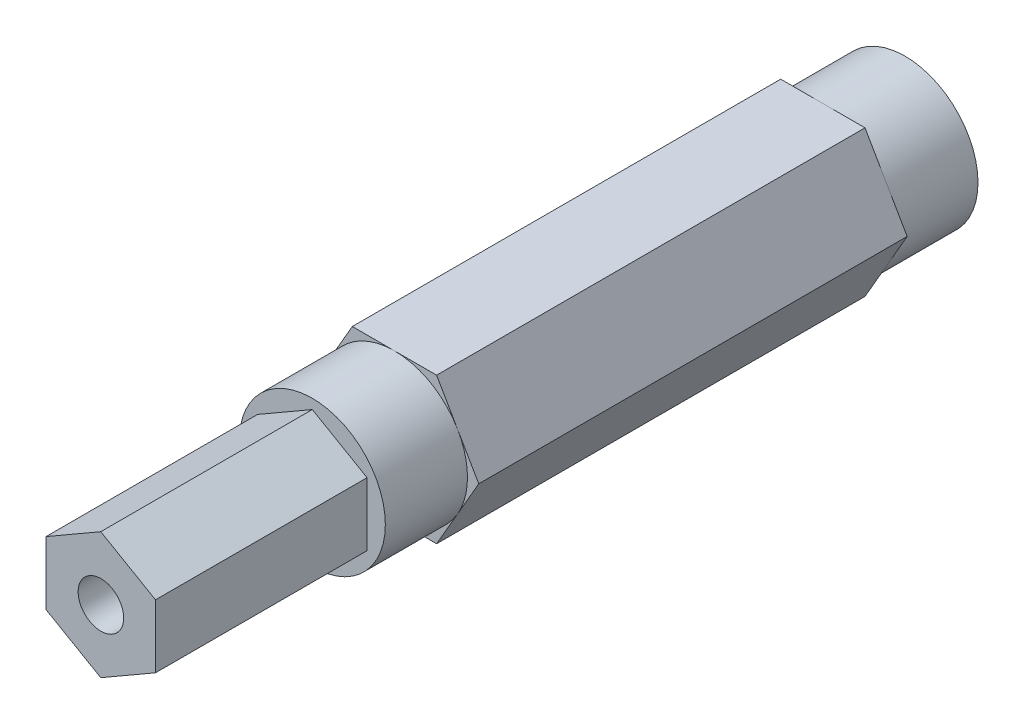
ISO-10303-21;
HEADER;
FILE_DESCRIPTION(('STEP AP214'),'2;1');
FILE_NAME('part.step','',(''),(''),'','','');
FILE_SCHEMA(('AUTOMOTIVE_DESIGN { 1 0 10303 214 1 1 1 1 }'));
ENDSEC;
DATA;
#1=APPLICATION_CONTEXT('core data for automotive mechanical design processes');
#2=APPLICATION_PROTOCOL_DEFINITION('international standard','automotive_design',2000,#1);
#3=PRODUCT_CONTEXT('',#1,'mechanical');
#4=PRODUCT('Part','Part','',(#3));
#5=PRODUCT_RELATED_PRODUCT_CATEGORY('part','',(#4));
#6=PRODUCT_DEFINITION_FORMATION('','',#4);
#7=PRODUCT_DEFINITION_CONTEXT('part definition',#1,'design');
#8=PRODUCT_DEFINITION('design','',#6,#7);
#9=PRODUCT_DEFINITION_SHAPE('','',#8);
#10=(LENGTH_UNIT() NAMED_UNIT(*) SI_UNIT(.MILLI.,.METRE.));
#11=(NAMED_UNIT(*) PLANE_ANGLE_UNIT() SI_UNIT($,.RADIAN.));
#12=(NAMED_UNIT(*) SI_UNIT($,.STERADIAN.) SOLID_ANGLE_UNIT());
#13=UNCERTAINTY_MEASURE_WITH_UNIT(LENGTH_MEASURE(1.E-05),#10,'distance_accuracy_value','');
#14=(GEOMETRIC_REPRESENTATION_CONTEXT(3) GLOBAL_UNCERTAINTY_ASSIGNED_CONTEXT((#13)) GLOBAL_UNIT_ASSIGNED_CONTEXT((#10,
#11,#12)) REPRESENTATION_CONTEXT('',''));
#15=CARTESIAN_POINT('',(0.,0.,0.));
#16=DIRECTION('',(0.,0.,1.));
#17=DIRECTION('',(1.,0.,0.));
#18=AXIS2_PLACEMENT_3D('',#15,#16,#17);
#19=CARTESIAN_POINT('',(0.0127,-0.00733234841871,31.4759999892544));
#20=DIRECTION('',(0.,0.,1.));
#21=DIRECTION('',(1.,0.,0.));
#22=AXIS2_PLACEMENT_3D('',#19,#20,#21);
#23=CONICAL_SURFACE('',#22,1.98120000005906,1.02974425866602);
#24=CARTESIAN_POINT('',(0.0126999999565669,-0.00733234841871,30.2855749307867));
#25=VERTEX_POINT('',#24);
#26=VERTEX_LOOP('',#25);
#27=FACE_BOUND('',#26,.T.);
#28=CARTESIAN_POINT('',(0.0127,-0.00733234841871,31.4759999892));
#29=DIRECTION('',(0.,0.,1.));
#30=DIRECTION('',(1.,0.,0.));
#31=AXIS2_PLACEMENT_3D('',#28,#29,#30);
#32=CIRCLE('',#31,1.9812);
#33=CARTESIAN_POINT('',(1.9939,-0.00733234841871,31.4759999892));
#34=VERTEX_POINT('',#33);
#35=EDGE_CURVE('E222',#34,#34,#32,.T.);
#36=ORIENTED_EDGE('',*,*,#35,.T.);
#37=EDGE_LOOP('',(#36));
#38=FACE_BOUND('',#37,.T.);
#39=ADVANCED_FACE('F17',(#27,#38),#23,.F.);
#40=CARTESIAN_POINT('',(0.0127,-0.00733234841871,37.8259999892));
#41=DIRECTION('',(0.,0.,1.));
#42=DIRECTION('',(1.,0.,0.));
#43=AXIS2_PLACEMENT_3D('',#40,#41,#42);
#44=CYLINDRICAL_SURFACE('',#43,1.9812);
#45=ORIENTED_EDGE('',*,*,#35,.F.);
#46=EDGE_LOOP('',(#45));
#47=FACE_BOUND('',#46,.T.);
#48=CARTESIAN_POINT('',(0.0127,-0.00733234841871,44.1759999888));
#49=DIRECTION('',(0.,0.,1.));
#50=DIRECTION('',(1.,0.,0.));
#51=AXIS2_PLACEMENT_3D('',#48,#49,#50);
#52=CIRCLE('',#51,1.9812);
#53=CARTESIAN_POINT('',(1.9939,-0.00733234841871,44.1759999888));
#54=VERTEX_POINT('',#53);
#55=EDGE_CURVE('E20',#54,#54,#52,.F.);
#56=ORIENTED_EDGE('',*,*,#55,.F.);
#57=EDGE_LOOP('',(#56));
#58=FACE_BOUND('',#57,.T.);
#59=ADVANCED_FACE('F680',(#47,#58),#44,.F.);
#60=CARTESIAN_POINT('',(0.,0.,44.1759999892));
#61=DIRECTION('',(0.,0.,1.));
#62=DIRECTION('',(1.,0.,0.));
#63=AXIS2_PLACEMENT_3D('',#60,#61,#62);
#64=PLANE('',#63);
#65=ORIENTED_EDGE('',*,*,#55,.T.);
#66=EDGE_LOOP('',(#65));
#67=FACE_BOUND('',#66,.T.);
#68=DIRECTION('',(0.866025403784329,0.50000000000019,0.));
#69=VECTOR('',#68,1.);
#70=CARTESIAN_POINT('',(0.,-5.49926131403,44.1759999897));
#71=LINE('',#70,#69);
#72=CARTESIAN_POINT('',(4.76250000000908,-2.7496306570084,44.175999989575));
#73=VERTEX_POINT('',#72);
#74=CARTESIAN_POINT('',(1.09530182891988E-11,-5.49926131403398,44.175999989575));
#75=VERTEX_POINT('',#74);
#76=EDGE_CURVE('E230',#73,#75,#71,.F.);
#77=ORIENTED_EDGE('',*,*,#76,.F.);
#78=DIRECTION('',(0.,1.,0.));
#79=VECTOR('',#78,1.);
#80=CARTESIAN_POINT('',(4.7625,-2.74963065702,44.1759999897));
#81=LINE('',#80,#79);
#82=CARTESIAN_POINT('',(4.76250000000892,2.74963065702235,44.17599998945));
#83=VERTEX_POINT('',#82);
#84=EDGE_CURVE('E225',#83,#73,#81,.F.);
#85=ORIENTED_EDGE('',*,*,#84,.F.);
#86=DIRECTION('',(-0.866025403784329,0.50000000000019,0.));
#87=VECTOR('',#86,1.);
#88=CARTESIAN_POINT('',(4.7625,2.74963065702,44.1759999897));
#89=LINE('',#88,#87);
#90=CARTESIAN_POINT('',(7.50842530511384E-13,5.49926131403131,44.175999989575));
#91=VERTEX_POINT('',#90);
#92=EDGE_CURVE('E250',#91,#83,#89,.F.);
#93=ORIENTED_EDGE('',*,*,#92,.F.);
#94=DIRECTION('',(-0.866025403784329,-0.50000000000019,0.));
#95=VECTOR('',#94,1.);
#96=CARTESIAN_POINT('',(0.,5.49926131403,44.1759999897));
#97=LINE('',#96,#95);
#98=CARTESIAN_POINT('',(-4.76249999999924,2.74963065701869,44.175999989575));
#99=VERTEX_POINT('',#98);
#100=EDGE_CURVE('E245',#99,#91,#97,.F.);
#101=ORIENTED_EDGE('',*,*,#100,.F.);
#102=DIRECTION('',(0.,-1.,0.));
#103=VECTOR('',#102,1.);
#104=CARTESIAN_POINT('',(-4.7625,2.74963065702,44.1759999897));
#105=LINE('',#104,#103);
#106=CARTESIAN_POINT('',(-4.7625,-2.74963065702,44.175999989575));
#107=VERTEX_POINT('',#106);
#108=EDGE_CURVE('E240',#107,#99,#105,.F.);
#109=ORIENTED_EDGE('',*,*,#108,.F.);
#110=DIRECTION('',(0.866025403784329,-0.50000000000019,0.));
#111=VECTOR('',#110,1.);
#112=CARTESIAN_POINT('',(-4.7625,-2.74963065702,44.1759999897));
#113=LINE('',#112,#111);
#114=EDGE_CURVE('E235',#75,#107,#113,.F.);
#115=ORIENTED_EDGE('',*,*,#114,.F.);
#116=EDGE_LOOP('',(#77,#85,#93,#101,#109,#115));
#117=FACE_BOUND('',#116,.T.);
#118=ADVANCED_FACE('F671',(#67,#117),#64,.T.);
#119=CARTESIAN_POINT('',(4.7625,-2.74963065702,0.));
#120=DIRECTION('',(1.,0.,0.));
#121=DIRECTION('',(0.,1.,0.));
#122=AXIS2_PLACEMENT_3D('',#119,#120,#121);
#123=PLANE('',#122);
#124=ORIENTED_EDGE('',*,*,#84,.T.);
#125=DIRECTION('',(0.,0.,1.));
#126=VECTOR('',#125,1.);
#127=CARTESIAN_POINT('',(4.76250000001631,-2.7496306570036,0.));
#128=LINE('',#127,#126);
#129=CARTESIAN_POINT('',(4.76250000000408,-2.74963065701129,25.77465));
#130=VERTEX_POINT('',#129);
#131=EDGE_CURVE('E227',#130,#73,#128,.T.);
#132=ORIENTED_EDGE('',*,*,#131,.F.);
#133=DIRECTION('',(0.,1.,0.));
#134=VECTOR('',#133,1.);
#135=CARTESIAN_POINT('',(4.7625,0.,25.77465));
#136=LINE('',#135,#134);
#137=CARTESIAN_POINT('',(4.76249999999892,2.74963065702813,25.77465));
#138=VERTEX_POINT('',#137);
#139=EDGE_CURVE('E173',#138,#130,#136,.F.);
#140=ORIENTED_EDGE('',*,*,#139,.F.);
#141=DIRECTION('',(0.,0.,1.));
#142=VECTOR('',#141,1.);
#143=CARTESIAN_POINT('',(4.76249999999567,2.7496306570225,0.));
#144=LINE('',#143,#142);
#145=EDGE_CURVE('E253',#83,#138,#144,.F.);
#146=ORIENTED_EDGE('',*,*,#145,.F.);
#147=EDGE_LOOP('',(#124,#132,#140,#146));
#148=FACE_BOUND('',#147,.T.);
#149=ADVANCED_FACE('F662',(#148),#123,.T.);
#150=CARTESIAN_POINT('',(0.,-5.49926131403,0.));
#151=DIRECTION('',(0.50000000000019,-0.866025403784329,0.));
#152=DIRECTION('',(0.866025403784329,0.50000000000019,0.));
#153=AXIS2_PLACEMENT_3D('',#150,#151,#152);
#154=PLANE('',#153);
#155=ORIENTED_EDGE('',*,*,#76,.T.);
#156=DIRECTION('',(0.,0.,1.));
#157=VECTOR('',#156,1.);
#158=CARTESIAN_POINT('',(1.31127747549087E-11,-5.49926131404456,0.));
#159=LINE('',#158,#157);
#160=CARTESIAN_POINT('',(1.09528285538187E-11,-5.49926131403398,25.77465));
#161=VERTEX_POINT('',#160);
#162=EDGE_CURVE('E232',#161,#75,#159,.T.);
#163=ORIENTED_EDGE('',*,*,#162,.F.);
#164=DIRECTION('',(-0.866025403783498,-0.50000000000163,0.));
#165=VECTOR('',#164,1.);
#166=CARTESIAN_POINT('',(4.76250000002,-2.74963065701,25.77465));
#167=LINE('',#166,#165);
#168=EDGE_CURVE('E293',#130,#161,#167,.T.);
#169=ORIENTED_EDGE('',*,*,#168,.F.);
#170=ORIENTED_EDGE('',*,*,#131,.T.);
#171=EDGE_LOOP('',(#155,#163,#169,#170));
#172=FACE_BOUND('',#171,.T.);
#173=ADVANCED_FACE('F653',(#172),#154,.T.);
#174=CARTESIAN_POINT('',(-4.7625,-2.74963065702,0.));
#175=DIRECTION('',(-0.50000000000019,-0.866025403784329,0.));
#176=DIRECTION('',(0.866025403784329,-0.50000000000019,0.));
#177=AXIS2_PLACEMENT_3D('',#174,#175,#176);
#178=PLANE('',#177);
#179=ORIENTED_EDGE('',*,*,#114,.T.);
#180=DIRECTION('',(0.,0.,1.));
#181=VECTOR('',#180,1.);
#182=CARTESIAN_POINT('',(-4.7625,-2.74963065702,0.));
#183=LINE('',#182,#181);
#184=CARTESIAN_POINT('',(-4.7625,-2.74963065702,25.77465));
#185=VERTEX_POINT('',#184);
#186=EDGE_CURVE('E237',#185,#107,#183,.T.);
#187=ORIENTED_EDGE('',*,*,#186,.F.);
#188=DIRECTION('',(-0.866025403784807,0.499999999999361,0.));
#189=VECTOR('',#188,1.);
#190=CARTESIAN_POINT('',(1.57438506676E-11,-5.49926131404,25.77465));
#191=LINE('',#190,#189);
#192=EDGE_CURVE('E296',#161,#185,#191,.T.);
#193=ORIENTED_EDGE('',*,*,#192,.F.);
#194=ORIENTED_EDGE('',*,*,#162,.T.);
#195=EDGE_LOOP('',(#179,#187,#193,#194));
#196=FACE_BOUND('',#195,.T.);
#197=ADVANCED_FACE('F644',(#196),#178,.T.);
#198=CARTESIAN_POINT('',(-4.7625,2.74963065702,0.));
#199=DIRECTION('',(-1.,0.,0.));
#200=DIRECTION('',(0.,-1.,0.));
#201=AXIS2_PLACEMENT_3D('',#198,#199,#200);
#202=PLANE('',#201);
#203=ORIENTED_EDGE('',*,*,#108,.T.);
#204=DIRECTION('',(0.,0.,1.));
#205=VECTOR('',#204,1.);
#206=CARTESIAN_POINT('',(-4.76249999999698,2.74963065701476,0.));
#207=LINE('',#206,#205);
#208=CARTESIAN_POINT('',(-4.76249999999924,2.74963065701869,25.77465));
#209=VERTEX_POINT('',#208);
#210=EDGE_CURVE('E242',#209,#99,#207,.T.);
#211=ORIENTED_EDGE('',*,*,#210,.F.);
#212=DIRECTION('',(0.,1.,0.));
#213=VECTOR('',#212,1.);
#214=CARTESIAN_POINT('',(-4.7625,0.,25.77465));
#215=LINE('',#214,#213);
#216=EDGE_CURVE('E299',#185,#209,#215,.T.);
#217=ORIENTED_EDGE('',*,*,#216,.F.);
#218=ORIENTED_EDGE('',*,*,#186,.T.);
#219=EDGE_LOOP('',(#203,#211,#217,#218));
#220=FACE_BOUND('',#219,.T.);
#221=ADVANCED_FACE('F635',(#220),#202,.T.);
#222=CARTESIAN_POINT('',(0.,5.49926131403,0.));
#223=DIRECTION('',(-0.50000000000019,0.866025403784329,0.));
#224=DIRECTION('',(-0.866025403784329,-0.50000000000019,0.));
#225=AXIS2_PLACEMENT_3D('',#222,#223,#224);
#226=PLANE('',#225);
#227=ORIENTED_EDGE('',*,*,#100,.T.);
#228=DIRECTION('',(0.,0.,1.));
#229=VECTOR('',#228,1.);
#230=CARTESIAN_POINT('',(3.02015357167562E-12,5.49926131403524,0.));
#231=LINE('',#230,#229);
#232=CARTESIAN_POINT('',(7.50985318560359E-13,5.49926131403131,25.77465));
#233=VERTEX_POINT('',#232);
#234=EDGE_CURVE('E247',#233,#91,#231,.T.);
#235=ORIENTED_EDGE('',*,*,#234,.F.);
#236=DIRECTION('',(0.866025403784879,0.499999999999238,0.));
#237=VECTOR('',#236,1.);
#238=CARTESIAN_POINT('',(-4.7625,2.74963065702,25.77465));
#239=LINE('',#238,#237);
#240=EDGE_CURVE('E182',#209,#233,#239,.T.);
#241=ORIENTED_EDGE('',*,*,#240,.F.);
#242=ORIENTED_EDGE('',*,*,#210,.T.);
#243=EDGE_LOOP('',(#227,#235,#241,#242));
#244=FACE_BOUND('',#243,.T.);
#245=ADVANCED_FACE('F626',(#244),#226,.T.);
#246=CARTESIAN_POINT('',(4.7625,2.74963065702,0.));
#247=DIRECTION('',(0.50000000000019,0.866025403784329,0.));
#248=DIRECTION('',(-0.866025403784329,0.50000000000019,0.));
#249=AXIS2_PLACEMENT_3D('',#246,#247,#248);
#250=PLANE('',#249);
#251=ORIENTED_EDGE('',*,*,#92,.T.);
#252=ORIENTED_EDGE('',*,*,#145,.T.);
#253=DIRECTION('',(0.866025403785667,-0.499999999997873,0.));
#254=VECTOR('',#253,1.);
#255=CARTESIAN_POINT('',(0.,5.49926131403,25.77465));
#256=LINE('',#255,#254);
#257=EDGE_CURVE('E179',#233,#138,#256,.T.);
#258=ORIENTED_EDGE('',*,*,#257,.F.);
#259=ORIENTED_EDGE('',*,*,#234,.T.);
#260=EDGE_LOOP('',(#251,#252,#258,#259));
#261=FACE_BOUND('',#260,.T.);
#262=ADVANCED_FACE('F618',(#261),#250,.T.);
#263=CARTESIAN_POINT('',(0.,0.,18.6309));
#264=DIRECTION('',(0.,0.,1.));
#265=DIRECTION('',(1.,0.,0.));
#266=AXIS2_PLACEMENT_3D('',#263,#264,#265);
#267=PLANE('',#266);
#268=DIRECTION('',(-0.50000000000019,0.866025403784329,0.));
#269=VECTOR('',#268,1.);
#270=CARTESIAN_POINT('',(7.33234841871,0.,18.6309));
#271=LINE('',#270,#269);
#272=CARTESIAN_POINT('',(3.666174208901,6.35000000008718,18.6308999995333));
#273=VERTEX_POINT('',#272);
#274=CARTESIAN_POINT('',(5.4992613137898,3.17500000041778,18.63089999965));
#275=VERTEX_POINT('',#274);
#276=EDGE_CURVE('E160',#273,#275,#271,.F.);
#277=ORIENTED_EDGE('',*,*,#276,.F.);
#278=DIRECTION('',(-1.,0.,0.));
#279=VECTOR('',#278,1.);
#280=CARTESIAN_POINT('',(3.66617420935,6.35,18.6308999993));
#281=LINE('',#280,#279);
#282=CARTESIAN_POINT('',(0.,6.35,18.6308999993));
#283=VERTEX_POINT('',#282);
#284=EDGE_CURVE('E176',#283,#273,#281,.F.);
#285=ORIENTED_EDGE('',*,*,#284,.F.);
#286=CARTESIAN_POINT('',(0.,0.,18.6308999993));
#287=DIRECTION('',(0.,0.,1.));
#288=DIRECTION('',(1.,0.,0.));
#289=AXIS2_PLACEMENT_3D('',#286,#287,#288);
#290=CIRCLE('',#289,6.35);
#291=EDGE_CURVE('E143',#275,#283,#290,.T.);
#292=ORIENTED_EDGE('',*,*,#291,.F.);
#293=EDGE_LOOP('',(#277,#285,#292));
#294=FACE_BOUND('',#293,.T.);
#295=ADVANCED_FACE('F175',(#294),#267,.T.);
#296=CARTESIAN_POINT('',(0.,0.,-18.6309));
#297=DIRECTION('',(0.,0.,-1.));
#298=DIRECTION('',(-1.,0.,0.));
#299=AXIS2_PLACEMENT_3D('',#296,#297,#298);
#300=PLANE('',#299);
#301=DIRECTION('',(-1.,0.,0.));
#302=VECTOR('',#301,1.);
#303=CARTESIAN_POINT('',(3.66617420935,6.35,-18.6309));
#304=LINE('',#303,#302);
#305=CARTESIAN_POINT('',(3.66617420895441,6.34999999999468,-18.6308999997667));
#306=VERTEX_POINT('',#305);
#307=CARTESIAN_POINT('',(0.,6.349999999815,-18.63089999965));
#308=VERTEX_POINT('',#307);
#309=EDGE_CURVE('E265',#306,#308,#304,.T.);
#310=ORIENTED_EDGE('',*,*,#309,.F.);
#311=DIRECTION('',(-0.50000000000019,0.866025403784329,0.));
#312=VECTOR('',#311,1.);
#313=CARTESIAN_POINT('',(7.33234841871,0.,-18.6308999993));
#314=LINE('',#313,#312);
#315=CARTESIAN_POINT('',(5.499261314031,3.17500000000104,-18.6308999993));
#316=VERTEX_POINT('',#315);
#317=EDGE_CURVE('E168',#316,#306,#314,.T.);
#318=ORIENTED_EDGE('',*,*,#317,.F.);
#319=CARTESIAN_POINT('',(0.,0.,-18.6308999993));
#320=DIRECTION('',(0.,0.,1.));
#321=DIRECTION('',(1.,0.,0.));
#322=AXIS2_PLACEMENT_3D('',#319,#320,#321);
#323=CIRCLE('',#322,6.35);
#324=EDGE_CURVE('E188',#308,#316,#323,.F.);
#325=ORIENTED_EDGE('',*,*,#324,.F.);
#326=EDGE_LOOP('',(#310,#318,#325));
#327=FACE_BOUND('',#326,.T.);
#328=ADVANCED_FACE('F428',(#327),#300,.T.);
#329=CARTESIAN_POINT('',(0.,0.,-25.77465));
#330=DIRECTION('',(0.,0.,1.));
#331=DIRECTION('',(1.,0.,0.));
#332=AXIS2_PLACEMENT_3D('',#329,#330,#331);
#333=PLANE('',#332);
#334=CARTESIAN_POINT('',(0.,0.,-25.77465));
#335=DIRECTION('',(0.,0.,1.));
#336=DIRECTION('',(1.,0.,0.));
#337=AXIS2_PLACEMENT_3D('',#334,#335,#336);
#338=CIRCLE('',#337,6.35);
#339=CARTESIAN_POINT('',(6.35,0.,-25.77465));
#340=VERTEX_POINT('',#339);
#341=EDGE_CURVE('E194',#340,#340,#338,.T.);
#342=ORIENTED_EDGE('',*,*,#341,.F.);
#343=EDGE_LOOP('',(#342));
#344=FACE_BOUND('',#343,.T.);
#345=ADVANCED_FACE('F432',(#344),#333,.F.);
#346=CARTESIAN_POINT('',(0.,0.,-18.6309));
#347=DIRECTION('',(0.,0.,-1.));
#348=DIRECTION('',(-1.,0.,0.));
#349=AXIS2_PLACEMENT_3D('',#346,#347,#348);
#350=PLANE('',#349);
#351=DIRECTION('',(-0.50000000000019,0.866025403784329,0.));
#352=VECTOR('',#351,1.);
#353=CARTESIAN_POINT('',(7.33234841871,0.,-18.6309));
#354=LINE('',#353,#352);
#355=CARTESIAN_POINT('',(7.33234841878749,2.32970767983556E-10,-18.6308999995333));
#356=VERTEX_POINT('',#355);
#357=EDGE_CURVE('E256',#356,#316,#354,.T.);
#358=ORIENTED_EDGE('',*,*,#357,.F.);
#359=DIRECTION('',(0.50000000000019,0.866025403784329,0.));
#360=VECTOR('',#359,1.);
#361=CARTESIAN_POINT('',(3.66617420935,-6.35,-18.6308999993));
#362=LINE('',#361,#360);
#363=CARTESIAN_POINT('',(5.49926131402949,-3.17500000000017,-18.63089999965));
#364=VERTEX_POINT('',#363);
#365=EDGE_CURVE('E275',#364,#356,#362,.T.);
#366=ORIENTED_EDGE('',*,*,#365,.F.);
#367=CARTESIAN_POINT('',(0.,0.,-18.6309));
#368=DIRECTION('',(0.,0.,1.));
#369=DIRECTION('',(1.,0.,0.));
#370=AXIS2_PLACEMENT_3D('',#367,#368,#369);
#371=CIRCLE('',#370,6.35);
#372=EDGE_CURVE('E192',#316,#364,#371,.F.);
#373=ORIENTED_EDGE('',*,*,#372,.F.);
#374=EDGE_LOOP('',(#358,#366,#373));
#375=FACE_BOUND('',#374,.T.);
#376=ADVANCED_FACE('F430',(#375),#350,.T.);
#377=CARTESIAN_POINT('',(7.33234841871,0.,0.));
#378=DIRECTION('',(0.866025403784329,0.50000000000019,0.));
#379=DIRECTION('',(-0.50000000000019,0.866025403784329,0.));
#380=AXIS2_PLACEMENT_3D('',#377,#378,#379);
#381=PLANE('',#380);
#382=DIRECTION('',(0.,0.,1.));
#383=VECTOR('',#382,1.);
#384=CARTESIAN_POINT('',(3.66617420875,6.35,0.));
#385=LINE('',#384,#383);
#386=EDGE_CURVE('E165',#273,#306,#385,.F.);
#387=ORIENTED_EDGE('',*,*,#386,.F.);
#388=ORIENTED_EDGE('',*,*,#276,.T.);
#389=DIRECTION('',(-0.500000000131528,0.866025403708501,0.));
#390=VECTOR('',#389,1.);
#391=CARTESIAN_POINT('',(7.33234841935,0.,18.6309));
#392=LINE('',#391,#390);
#393=CARTESIAN_POINT('',(7.33234841902799,1.85912505337899E-10,18.6309));
#394=VERTEX_POINT('',#393);
#395=EDGE_CURVE('E163',#394,#275,#392,.T.);
#396=ORIENTED_EDGE('',*,*,#395,.F.);
#397=DIRECTION('',(0.,0.,1.));
#398=VECTOR('',#397,1.);
#399=CARTESIAN_POINT('',(7.33234841886699,2.78868941827604E-10,0.));
#400=LINE('',#399,#398);
#401=EDGE_CURVE('E278',#356,#394,#400,.T.);
#402=ORIENTED_EDGE('',*,*,#401,.F.);
#403=ORIENTED_EDGE('',*,*,#357,.T.);
#404=ORIENTED_EDGE('',*,*,#317,.T.);
#405=EDGE_LOOP('',(#387,#388,#396,#402,#403,#404));
#406=FACE_BOUND('',#405,.T.);
#407=ADVANCED_FACE('F161',(#406),#381,.T.);
#408=CARTESIAN_POINT('',(0.,0.,18.6309));
#409=DIRECTION('',(0.,0.,1.));
#410=DIRECTION('',(1.,0.,0.));
#411=AXIS2_PLACEMENT_3D('',#408,#409,#410);
#412=PLANE('',#411);
#413=DIRECTION('',(0.50000000000019,0.866025403784329,0.));
#414=VECTOR('',#413,1.);
#415=CARTESIAN_POINT('',(3.66617420935,-6.35,18.6309));
#416=LINE('',#415,#414);
#417=CARTESIAN_POINT('',(5.49926131372319,-3.17500000052968,18.63089999965));
#418=VERTEX_POINT('',#417);
#419=EDGE_CURVE('E171',#394,#418,#416,.F.);
#420=ORIENTED_EDGE('',*,*,#419,.F.);
#421=ORIENTED_EDGE('',*,*,#395,.T.);
#422=CARTESIAN_POINT('',(0.,0.,18.6308999993));
#423=DIRECTION('',(0.,0.,1.));
#424=DIRECTION('',(1.,0.,0.));
#425=AXIS2_PLACEMENT_3D('',#422,#423,#424);
#426=CIRCLE('',#425,6.35);
#427=EDGE_CURVE('E147',#418,#275,#426,.T.);
#428=ORIENTED_EDGE('',*,*,#427,.F.);
#429=EDGE_LOOP('',(#420,#421,#428));
#430=FACE_BOUND('',#429,.T.);
#431=ADVANCED_FACE('F170',(#430),#412,.T.);
#432=CARTESIAN_POINT('',(0.,0.,25.77465));
#433=DIRECTION('',(0.,0.,1.));
#434=DIRECTION('',(1.,0.,0.));
#435=AXIS2_PLACEMENT_3D('',#432,#433,#434);
#436=PLANE('',#435);
#437=ORIENTED_EDGE('',*,*,#240,.T.);
#438=ORIENTED_EDGE('',*,*,#257,.T.);
#439=ORIENTED_EDGE('',*,*,#139,.T.);
#440=ORIENTED_EDGE('',*,*,#168,.T.);
#441=ORIENTED_EDGE('',*,*,#192,.T.);
#442=ORIENTED_EDGE('',*,*,#216,.T.);
#443=EDGE_LOOP('',(#437,#438,#439,#440,#441,#442));
#444=FACE_BOUND('',#443,.T.);
#445=CARTESIAN_POINT('',(0.,0.,25.77465));
#446=DIRECTION('',(0.,0.,1.));
#447=DIRECTION('',(1.,0.,0.));
#448=AXIS2_PLACEMENT_3D('',#445,#446,#447);
#449=CIRCLE('',#448,6.35);
#450=CARTESIAN_POINT('',(6.35,0.,25.77465));
#451=VERTEX_POINT('',#450);
#452=EDGE_CURVE('E156',#451,#451,#449,.F.);
#453=ORIENTED_EDGE('',*,*,#452,.F.);
#454=EDGE_LOOP('',(#453));
#455=FACE_BOUND('',#454,.T.);
#456=ADVANCED_FACE('F477',(#444,#455),#436,.T.);
#457=CARTESIAN_POINT('',(0.,0.,18.6309));
#458=DIRECTION('',(0.,0.,1.));
#459=DIRECTION('',(1.,0.,0.));
#460=AXIS2_PLACEMENT_3D('',#457,#458,#459);
#461=PLANE('',#460);
#462=DIRECTION('',(-1.,0.,0.));
#463=VECTOR('',#462,1.);
#464=CARTESIAN_POINT('',(3.66617420935,6.35,18.6309));
#465=LINE('',#464,#463);
#466=CARTESIAN_POINT('',(-3.66617420936021,6.3499999999882,18.6308999995333));
#467=VERTEX_POINT('',#466);
#468=EDGE_CURVE('E272',#467,#283,#465,.F.);
#469=ORIENTED_EDGE('',*,*,#468,.F.);
#470=DIRECTION('',(-0.50000000000019,-0.866025403784329,0.));
#471=VECTOR('',#470,1.);
#472=CARTESIAN_POINT('',(-3.66617420935,6.35,18.6308999993));
#473=LINE('',#472,#471);
#474=CARTESIAN_POINT('',(-5.49926131402949,3.17500000000017,18.6308999993));
#475=VERTEX_POINT('',#474);
#476=EDGE_CURVE('E208',#475,#467,#473,.F.);
#477=ORIENTED_EDGE('',*,*,#476,.F.);
#478=CARTESIAN_POINT('',(0.,0.,18.6308999993));
#479=DIRECTION('',(0.,0.,1.));
#480=DIRECTION('',(1.,0.,0.));
#481=AXIS2_PLACEMENT_3D('',#478,#479,#480);
#482=CIRCLE('',#481,6.35);
#483=EDGE_CURVE('E178',#475,#283,#482,.F.);
#484=ORIENTED_EDGE('',*,*,#483,.T.);
#485=EDGE_LOOP('',(#469,#477,#484));
#486=FACE_BOUND('',#485,.T.);
#487=ADVANCED_FACE('F474',(#486),#461,.T.);
#488=CARTESIAN_POINT('',(3.66617420935,6.35,0.));
#489=DIRECTION('',(0.,1.,0.));
#490=DIRECTION('',(-1.,0.,0.));
#491=AXIS2_PLACEMENT_3D('',#488,#489,#490);
#492=PLANE('',#491);
#493=DIRECTION('',(0.,0.,1.));
#494=VECTOR('',#493,1.);
#495=CARTESIAN_POINT('',(-3.66617420936021,6.34999999998231,0.));
#496=LINE('',#495,#494);
#497=CARTESIAN_POINT('',(-3.66617420915681,6.34999999986487,-18.6309));
#498=VERTEX_POINT('',#497);
#499=EDGE_CURVE('E310',#467,#498,#496,.F.);
#500=ORIENTED_EDGE('',*,*,#499,.F.);
#501=ORIENTED_EDGE('',*,*,#468,.T.);
#502=ORIENTED_EDGE('',*,*,#284,.T.);
#503=ORIENTED_EDGE('',*,*,#386,.T.);
#504=ORIENTED_EDGE('',*,*,#309,.T.);
#505=DIRECTION('',(-1.,0.,0.));
#506=VECTOR('',#505,1.);
#507=CARTESIAN_POINT('',(0.,6.34999999963,-18.6309));
#508=LINE('',#507,#506);
#509=EDGE_CURVE('E189',#498,#308,#508,.F.);
#510=ORIENTED_EDGE('',*,*,#509,.F.);
#511=EDGE_LOOP('',(#500,#501,#502,#503,#504,#510));
#512=FACE_BOUND('',#511,.T.);
#513=ADVANCED_FACE('F471',(#512),#492,.T.);
#514=CARTESIAN_POINT('',(0.,0.,-18.6309));
#515=DIRECTION('',(0.,0.,-1.));
#516=DIRECTION('',(-1.,0.,0.));
#517=AXIS2_PLACEMENT_3D('',#514,#515,#516);
#518=PLANE('',#517);
#519=DIRECTION('',(-0.50000000000019,-0.866025403784329,0.));
#520=VECTOR('',#519,1.);
#521=CARTESIAN_POINT('',(-3.66617420935,6.35,-18.6309));
#522=LINE('',#521,#520);
#523=CARTESIAN_POINT('',(-5.49926131378829,3.17500000041691,-18.63089999965));
#524=VERTEX_POINT('',#523);
#525=EDGE_CURVE('E313',#498,#524,#522,.T.);
#526=ORIENTED_EDGE('',*,*,#525,.F.);
#527=ORIENTED_EDGE('',*,*,#509,.T.);
#528=CARTESIAN_POINT('',(0.,0.,-18.6308999993));
#529=DIRECTION('',(0.,0.,1.));
#530=DIRECTION('',(1.,0.,0.));
#531=AXIS2_PLACEMENT_3D('',#528,#529,#530);
#532=CIRCLE('',#531,6.35);
#533=EDGE_CURVE('E185',#524,#308,#532,.F.);
#534=ORIENTED_EDGE('',*,*,#533,.F.);
#535=EDGE_LOOP('',(#526,#527,#534));
#536=FACE_BOUND('',#535,.T.);
#537=ADVANCED_FACE('F421',(#536),#518,.T.);
#538=CARTESIAN_POINT('',(0.,0.,0.));
#539=DIRECTION('',(0.,0.,1.));
#540=DIRECTION('',(1.,0.,0.));
#541=AXIS2_PLACEMENT_3D('',#538,#539,#540);
#542=CYLINDRICAL_SURFACE('',#541,6.35);
#543=ORIENTED_EDGE('',*,*,#324,.T.);
#544=ORIENTED_EDGE('',*,*,#372,.T.);
#545=CARTESIAN_POINT('',(0.,0.,-18.6308999993));
#546=DIRECTION('',(0.,0.,1.));
#547=DIRECTION('',(1.,0.,0.));
#548=AXIS2_PLACEMENT_3D('',#545,#546,#547);
#549=CIRCLE('',#548,6.35);
#550=CARTESIAN_POINT('',(0.,-6.35,-18.6308999993));
#551=VERTEX_POINT('',#550);
#552=EDGE_CURVE('E197',#551,#364,#549,.T.);
#553=ORIENTED_EDGE('',*,*,#552,.F.);
#554=CARTESIAN_POINT('',(0.,0.,-18.6308999993));
#555=DIRECTION('',(0.,0.,1.));
#556=DIRECTION('',(1.,0.,0.));
#557=AXIS2_PLACEMENT_3D('',#554,#555,#556);
#558=CIRCLE('',#557,6.35);
#559=CARTESIAN_POINT('',(-5.499261314031,-3.17500000000104,-18.6308999993));
#560=VERTEX_POINT('',#559);
#561=EDGE_CURVE('E214',#560,#551,#558,.T.);
#562=ORIENTED_EDGE('',*,*,#561,.F.);
#563=CARTESIAN_POINT('',(0.,0.,-18.6308999993));
#564=DIRECTION('',(0.,0.,1.));
#565=DIRECTION('',(1.,0.,0.));
#566=AXIS2_PLACEMENT_3D('',#563,#564,#565);
#567=CIRCLE('',#566,6.35);
#568=EDGE_CURVE('E209',#524,#560,#567,.T.);
#569=ORIENTED_EDGE('',*,*,#568,.F.);
#570=ORIENTED_EDGE('',*,*,#533,.T.);
#571=EDGE_LOOP('',(#543,#544,#553,#562,#569,#570));
#572=FACE_BOUND('',#571,.T.);
#573=ORIENTED_EDGE('',*,*,#341,.T.);
#574=EDGE_LOOP('',(#573));
#575=FACE_BOUND('',#574,.T.);
#576=ADVANCED_FACE('F418',(#572,#575),#542,.T.);
#577=CARTESIAN_POINT('',(0.,0.,-18.6309));
#578=DIRECTION('',(0.,0.,-1.));
#579=DIRECTION('',(-1.,0.,0.));
#580=AXIS2_PLACEMENT_3D('',#577,#578,#579);
#581=PLANE('',#580);
#582=DIRECTION('',(0.50000000000019,0.866025403784329,0.));
#583=VECTOR('',#582,1.);
#584=CARTESIAN_POINT('',(3.66617420935,-6.35,-18.6309));
#585=LINE('',#584,#583);
#586=CARTESIAN_POINT('',(3.6661742089,-6.3500000000866,-18.6308999995333));
#587=VERTEX_POINT('',#586);
#588=EDGE_CURVE('E200',#587,#364,#585,.T.);
#589=ORIENTED_EDGE('',*,*,#588,.F.);
#590=DIRECTION('',(1.,0.,0.));
#591=VECTOR('',#590,1.);
#592=CARTESIAN_POINT('',(-3.66617420935,-6.35,-18.6308999993));
#593=LINE('',#592,#591);
#594=EDGE_CURVE('E328',#551,#587,#593,.T.);
#595=ORIENTED_EDGE('',*,*,#594,.F.);
#596=ORIENTED_EDGE('',*,*,#552,.T.);
#597=EDGE_LOOP('',(#589,#595,#596));
#598=FACE_BOUND('',#597,.T.);
#599=ADVANCED_FACE('F398',(#598),#581,.T.);
#600=CARTESIAN_POINT('',(3.66617420935,-6.35,0.));
#601=DIRECTION('',(0.866025403784329,-0.50000000000019,0.));
#602=DIRECTION('',(0.50000000000019,0.866025403784329,0.));
#603=AXIS2_PLACEMENT_3D('',#600,#601,#602);
#604=PLANE('',#603);
#605=ORIENTED_EDGE('',*,*,#401,.T.);
#606=ORIENTED_EDGE('',*,*,#419,.T.);
#607=DIRECTION('',(0.500000000167046,0.866025403687995,0.));
#608=VECTOR('',#607,1.);
#609=CARTESIAN_POINT('',(3.66617420875,-6.34999999963,18.6309));
#610=LINE('',#609,#608);
#611=CARTESIAN_POINT('',(3.66617420867879,-6.35,18.6309));
#612=VERTEX_POINT('',#611);
#613=EDGE_CURVE('E201',#612,#418,#610,.T.);
#614=ORIENTED_EDGE('',*,*,#613,.F.);
#615=DIRECTION('',(0.,0.,-1.));
#616=VECTOR('',#615,1.);
#617=CARTESIAN_POINT('',(3.66617420875,-6.35,0.));
#618=LINE('',#617,#616);
#619=EDGE_CURVE('E331',#587,#612,#618,.F.);
#620=ORIENTED_EDGE('',*,*,#619,.F.);
#621=ORIENTED_EDGE('',*,*,#588,.T.);
#622=ORIENTED_EDGE('',*,*,#365,.T.);
#623=EDGE_LOOP('',(#605,#606,#614,#620,#621,#622));
#624=FACE_BOUND('',#623,.T.);
#625=ADVANCED_FACE('F402',(#624),#604,.T.);
#626=CARTESIAN_POINT('',(0.,0.,18.6309));
#627=DIRECTION('',(0.,0.,1.));
#628=DIRECTION('',(1.,0.,0.));
#629=AXIS2_PLACEMENT_3D('',#626,#627,#628);
#630=PLANE('',#629);
#631=DIRECTION('',(1.,0.,0.));
#632=VECTOR('',#631,1.);
#633=CARTESIAN_POINT('',(-3.66617420935,-6.35,18.6309));
#634=LINE('',#633,#632);
#635=CARTESIAN_POINT('',(0.,-6.349999999815,18.63089999965));
#636=VERTEX_POINT('',#635);
#637=EDGE_CURVE('E221',#612,#636,#634,.F.);
#638=ORIENTED_EDGE('',*,*,#637,.F.);
#639=ORIENTED_EDGE('',*,*,#613,.T.);
#640=CARTESIAN_POINT('',(0.,0.,18.6308999993));
#641=DIRECTION('',(0.,0.,1.));
#642=DIRECTION('',(1.,0.,0.));
#643=AXIS2_PLACEMENT_3D('',#640,#641,#642);
#644=CIRCLE('',#643,6.35);
#645=EDGE_CURVE('E152',#636,#418,#644,.T.);
#646=ORIENTED_EDGE('',*,*,#645,.F.);
#647=EDGE_LOOP('',(#638,#639,#646));
#648=FACE_BOUND('',#647,.T.);
#649=ADVANCED_FACE('F405',(#648),#630,.T.);
#650=CARTESIAN_POINT('',(0.,0.,0.));
#651=DIRECTION('',(0.,0.,1.));
#652=DIRECTION('',(1.,0.,0.));
#653=AXIS2_PLACEMENT_3D('',#650,#651,#652);
#654=CYLINDRICAL_SURFACE('',#653,6.35);
#655=CARTESIAN_POINT('',(0.,0.,18.6308999993));
#656=DIRECTION('',(0.,0.,1.));
#657=DIRECTION('',(1.,0.,0.));
#658=AXIS2_PLACEMENT_3D('',#655,#656,#657);
#659=CIRCLE('',#658,6.35);
#660=CARTESIAN_POINT('',(-5.499261314031,-3.17500000000104,18.6308999993));
#661=VERTEX_POINT('',#660);
#662=EDGE_CURVE('E205',#661,#475,#659,.F.);
#663=ORIENTED_EDGE('',*,*,#662,.F.);
#664=CARTESIAN_POINT('',(0.,0.,18.6308999993));
#665=DIRECTION('',(0.,0.,1.));
#666=DIRECTION('',(1.,0.,0.));
#667=AXIS2_PLACEMENT_3D('',#664,#665,#666);
#668=CIRCLE('',#667,6.35);
#669=EDGE_CURVE('E218',#636,#661,#668,.F.);
#670=ORIENTED_EDGE('',*,*,#669,.F.);
#671=ORIENTED_EDGE('',*,*,#645,.T.);
#672=ORIENTED_EDGE('',*,*,#427,.T.);
#673=ORIENTED_EDGE('',*,*,#291,.T.);
#674=ORIENTED_EDGE('',*,*,#483,.F.);
#675=EDGE_LOOP('',(#663,#670,#671,#672,#673,#674));
#676=FACE_BOUND('',#675,.T.);
#677=ORIENTED_EDGE('',*,*,#452,.T.);
#678=EDGE_LOOP('',(#677));
#679=FACE_BOUND('',#678,.T.);
#680=ADVANCED_FACE('F149',(#676,#679),#654,.T.);
#681=CARTESIAN_POINT('',(0.,0.,18.6309));
#682=DIRECTION('',(0.,0.,1.));
#683=DIRECTION('',(1.,0.,0.));
#684=AXIS2_PLACEMENT_3D('',#681,#682,#683);
#685=PLANE('',#684);
#686=DIRECTION('',(-0.50000000000019,-0.866025403784329,0.));
#687=VECTOR('',#686,1.);
#688=CARTESIAN_POINT('',(-3.66617420935,6.35,18.6309));
#689=LINE('',#688,#687);
#690=CARTESIAN_POINT('',(-7.332348418789,2.30359584163293E-10,18.6308999995333));
#691=VERTEX_POINT('',#690);
#692=EDGE_CURVE('E213',#691,#475,#689,.F.);
#693=ORIENTED_EDGE('',*,*,#692,.F.);
#694=DIRECTION('',(0.50000000000019,-0.866025403784329,0.));
#695=VECTOR('',#694,1.);
#696=CARTESIAN_POINT('',(-7.33234841871,0.,18.6308999993));
#697=LINE('',#696,#695);
#698=EDGE_CURVE('E357',#661,#691,#697,.F.);
#699=ORIENTED_EDGE('',*,*,#698,.F.);
#700=ORIENTED_EDGE('',*,*,#662,.T.);
#701=EDGE_LOOP('',(#693,#699,#700));
#702=FACE_BOUND('',#701,.T.);
#703=ADVANCED_FACE('F409',(#702),#685,.T.);
#704=CARTESIAN_POINT('',(-3.66617420935,6.35,0.));
#705=DIRECTION('',(-0.866025403784329,0.50000000000019,0.));
#706=DIRECTION('',(-0.50000000000019,-0.866025403784329,0.));
#707=AXIS2_PLACEMENT_3D('',#704,#705,#706);
#708=PLANE('',#707);
#709=DIRECTION('',(0.,0.,1.));
#710=VECTOR('',#709,1.);
#711=CARTESIAN_POINT('',(-7.33234841887,2.77127973540936E-10,0.));
#712=LINE('',#711,#710);
#713=CARTESIAN_POINT('',(-7.33234841903,1.84751846709216E-10,-18.6309));
#714=VERTEX_POINT('',#713);
#715=EDGE_CURVE('E353',#691,#714,#712,.F.);
#716=ORIENTED_EDGE('',*,*,#715,.F.);
#717=ORIENTED_EDGE('',*,*,#692,.T.);
#718=ORIENTED_EDGE('',*,*,#476,.T.);
#719=ORIENTED_EDGE('',*,*,#499,.T.);
#720=ORIENTED_EDGE('',*,*,#525,.T.);
#721=DIRECTION('',(0.500000000131528,0.866025403708501,0.));
#722=VECTOR('',#721,1.);
#723=CARTESIAN_POINT('',(-7.33234841935,0.,-18.6309));
#724=LINE('',#723,#722);
#725=EDGE_CURVE('E212',#714,#524,#724,.T.);
#726=ORIENTED_EDGE('',*,*,#725,.F.);
#727=EDGE_LOOP('',(#716,#717,#718,#719,#720,#726));
#728=FACE_BOUND('',#727,.T.);
#729=ADVANCED_FACE('F413',(#728),#708,.T.);
#730=CARTESIAN_POINT('',(0.,0.,-18.6309));
#731=DIRECTION('',(0.,0.,-1.));
#732=DIRECTION('',(-1.,0.,0.));
#733=AXIS2_PLACEMENT_3D('',#730,#731,#732);
#734=PLANE('',#733);
#735=DIRECTION('',(0.50000000000019,-0.866025403784329,0.));
#736=VECTOR('',#735,1.);
#737=CARTESIAN_POINT('',(-7.33234841871,0.,-18.6309));
#738=LINE('',#737,#736);
#739=EDGE_CURVE('E356',#714,#560,#738,.T.);
#740=ORIENTED_EDGE('',*,*,#739,.F.);
#741=ORIENTED_EDGE('',*,*,#725,.T.);
#742=ORIENTED_EDGE('',*,*,#568,.T.);
#743=EDGE_LOOP('',(#740,#741,#742));
#744=FACE_BOUND('',#743,.T.);
#745=ADVANCED_FACE('F416',(#744),#734,.T.);
#746=CARTESIAN_POINT('',(0.,0.,-18.6309));
#747=DIRECTION('',(0.,0.,-1.));
#748=DIRECTION('',(-1.,0.,0.));
#749=AXIS2_PLACEMENT_3D('',#746,#747,#748);
#750=PLANE('',#749);
#751=DIRECTION('',(1.,0.,0.));
#752=VECTOR('',#751,1.);
#753=CARTESIAN_POINT('',(-3.66617420935,-6.35,-18.6309));
#754=LINE('',#753,#752);
#755=CARTESIAN_POINT('',(-3.66617420936323,-6.34999999998937,-18.6308999995333));
#756=VERTEX_POINT('',#755);
#757=EDGE_CURVE('E217',#756,#551,#754,.T.);
#758=ORIENTED_EDGE('',*,*,#757,.F.);
#759=DIRECTION('',(0.50000000000019,-0.866025403784329,0.));
#760=VECTOR('',#759,1.);
#761=CARTESIAN_POINT('',(-7.33234841871,0.,-18.6308999993));
#762=LINE('',#761,#760);
#763=EDGE_CURVE('E366',#560,#756,#762,.T.);
#764=ORIENTED_EDGE('',*,*,#763,.F.);
#765=ORIENTED_EDGE('',*,*,#561,.T.);
#766=EDGE_LOOP('',(#758,#764,#765));
#767=FACE_BOUND('',#766,.T.);
#768=ADVANCED_FACE('F395',(#767),#750,.T.);
#769=CARTESIAN_POINT('',(-3.66617420935,-6.35,0.));
#770=DIRECTION('',(0.,-1.,0.));
#771=DIRECTION('',(0.,0.,-1.));
#772=AXIS2_PLACEMENT_3D('',#769,#770,#771);
#773=PLANE('',#772);
#774=ORIENTED_EDGE('',*,*,#619,.T.);
#775=ORIENTED_EDGE('',*,*,#637,.T.);
#776=DIRECTION('',(1.,0.,0.));
#777=VECTOR('',#776,1.);
#778=CARTESIAN_POINT('',(0.,-6.34999999963,18.6309));
#779=LINE('',#778,#777);
#780=CARTESIAN_POINT('',(-3.66617420915882,-6.34999999986603,18.6309));
#781=VERTEX_POINT('',#780);
#782=EDGE_CURVE('E35',#781,#636,#779,.T.);
#783=ORIENTED_EDGE('',*,*,#782,.F.);
#784=DIRECTION('',(0.,0.,1.));
#785=VECTOR('',#784,1.);
#786=CARTESIAN_POINT('',(-3.66617420936323,-6.34999999998405,0.));
#787=LINE('',#786,#785);
#788=EDGE_CURVE('E26',#756,#781,#787,.T.);
#789=ORIENTED_EDGE('',*,*,#788,.F.);
#790=ORIENTED_EDGE('',*,*,#757,.T.);
#791=ORIENTED_EDGE('',*,*,#594,.T.);
#792=EDGE_LOOP('',(#774,#775,#783,#789,#790,#791));
#793=FACE_BOUND('',#792,.T.);
#794=ADVANCED_FACE('F392',(#793),#773,.T.);
#795=CARTESIAN_POINT('',(0.,0.,18.6309));
#796=DIRECTION('',(0.,0.,1.));
#797=DIRECTION('',(1.,0.,0.));
#798=AXIS2_PLACEMENT_3D('',#795,#796,#797);
#799=PLANE('',#798);
#800=DIRECTION('',(0.50000000000019,-0.866025403784329,0.));
#801=VECTOR('',#800,1.);
#802=CARTESIAN_POINT('',(-7.33234841871,0.,18.6309));
#803=LINE('',#802,#801);
#804=EDGE_CURVE('E11',#781,#661,#803,.F.);
#805=ORIENTED_EDGE('',*,*,#804,.F.);
#806=ORIENTED_EDGE('',*,*,#782,.T.);
#807=ORIENTED_EDGE('',*,*,#669,.T.);
#808=EDGE_LOOP('',(#805,#806,#807));
#809=FACE_BOUND('',#808,.T.);
#810=ADVANCED_FACE('F388',(#809),#799,.T.);
#811=CARTESIAN_POINT('',(-7.33234841871,0.,0.));
#812=DIRECTION('',(-0.866025403784329,-0.50000000000019,0.));
#813=DIRECTION('',(0.50000000000019,-0.866025403784329,0.));
#814=AXIS2_PLACEMENT_3D('',#811,#812,#813);
#815=PLANE('',#814);
#816=ORIENTED_EDGE('',*,*,#788,.T.);
#817=ORIENTED_EDGE('',*,*,#804,.T.);
#818=ORIENTED_EDGE('',*,*,#698,.T.);
#819=ORIENTED_EDGE('',*,*,#715,.T.);
#820=ORIENTED_EDGE('',*,*,#739,.T.);
#821=ORIENTED_EDGE('',*,*,#763,.T.);
#822=EDGE_LOOP('',(#816,#817,#818,#819,#820,#821));
#823=FACE_BOUND('',#822,.T.);
#824=ADVANCED_FACE('F390',(#823),#815,.T.);
#825=CLOSED_SHELL('',(#39,#59,#118,#149,#173,#197,#221,#245,#262,#295,#328,#345,#376,#407,#431,
#456,#487,#513,#537,#576,#599,#625,#649,#680,#703,#729,#745,#768,#794,#810,#824));
#826=MANIFOLD_SOLID_BREP('B1',#825);
#827=ADVANCED_BREP_SHAPE_REPRESENTATION('',(#18,#826),#14);
#828=SHAPE_DEFINITION_REPRESENTATION(#9,#827);
ENDSEC;
END-ISO-10303-21;
